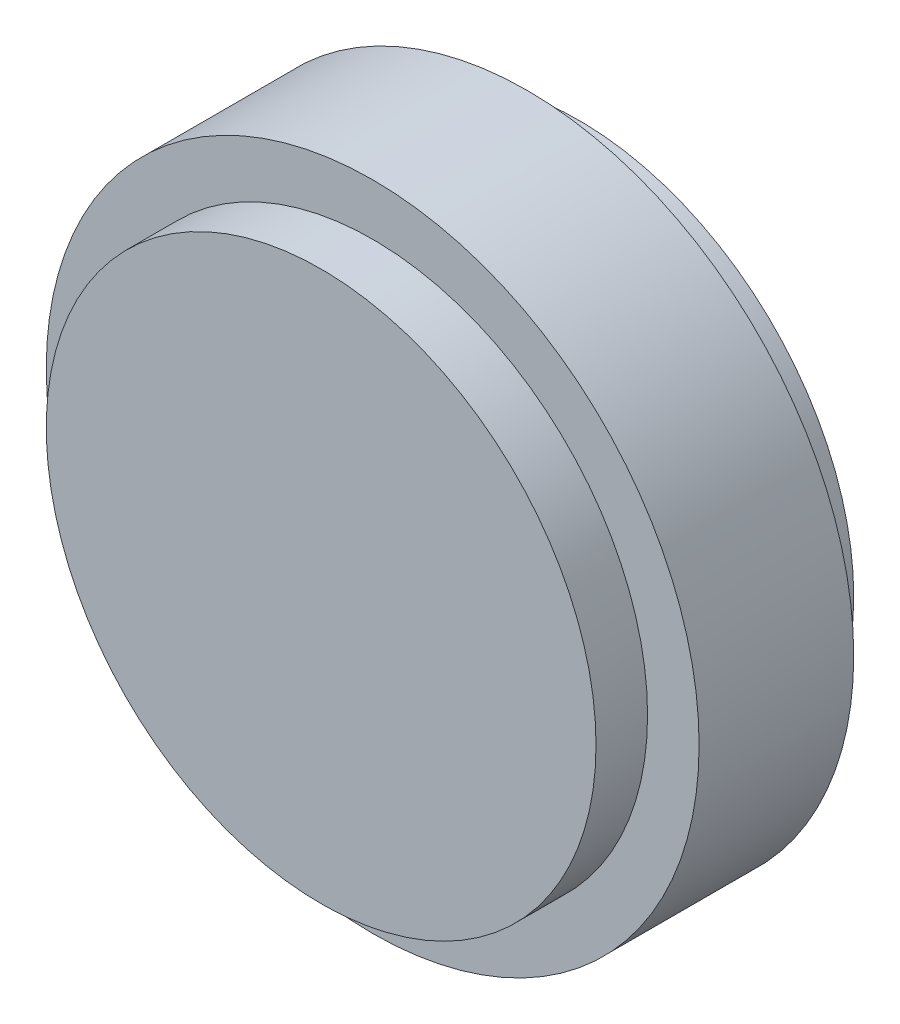
ISO-10303-21;
HEADER;
FILE_DESCRIPTION(('STEP AP214'),'2;1');
FILE_NAME('part.step','',(''),(''),'','','');
FILE_SCHEMA(('AUTOMOTIVE_DESIGN { 1 0 10303 214 1 1 1 1 }'));
ENDSEC;
DATA;
#1=APPLICATION_CONTEXT('core data for automotive mechanical design processes');
#2=APPLICATION_PROTOCOL_DEFINITION('international standard','automotive_design',2000,#1);
#3=PRODUCT_CONTEXT('',#1,'mechanical');
#4=PRODUCT('Part','Part','',(#3));
#5=PRODUCT_RELATED_PRODUCT_CATEGORY('part','',(#4));
#6=PRODUCT_DEFINITION_FORMATION('','',#4);
#7=PRODUCT_DEFINITION_CONTEXT('part definition',#1,'design');
#8=PRODUCT_DEFINITION('design','',#6,#7);
#9=PRODUCT_DEFINITION_SHAPE('','',#8);
#10=(LENGTH_UNIT() NAMED_UNIT(*) SI_UNIT(.MILLI.,.METRE.));
#11=(NAMED_UNIT(*) PLANE_ANGLE_UNIT() SI_UNIT($,.RADIAN.));
#12=(NAMED_UNIT(*) SI_UNIT($,.STERADIAN.) SOLID_ANGLE_UNIT());
#13=UNCERTAINTY_MEASURE_WITH_UNIT(LENGTH_MEASURE(1.E-05),#10,'distance_accuracy_value','');
#14=(GEOMETRIC_REPRESENTATION_CONTEXT(3) GLOBAL_UNCERTAINTY_ASSIGNED_CONTEXT((#13)) GLOBAL_UNIT_ASSIGNED_CONTEXT((#10,
#11,#12)) REPRESENTATION_CONTEXT('',''));
#15=CARTESIAN_POINT('',(0.,0.,0.));
#16=DIRECTION('',(0.,0.,1.));
#17=DIRECTION('',(1.,0.,0.));
#18=AXIS2_PLACEMENT_3D('',#15,#16,#17);
#19=CARTESIAN_POINT('',(0.,0.,0.));
#20=DIRECTION('',(0.,0.,-1.));
#21=DIRECTION('',(-1.,0.,0.));
#22=AXIS2_PLACEMENT_3D('',#19,#20,#21);
#23=PLANE('',#22);
#24=CARTESIAN_POINT('',(0.,0.,0.));
#25=DIRECTION('',(0.,0.,1.));
#26=DIRECTION('',(1.,0.,0.));
#27=AXIS2_PLACEMENT_3D('',#24,#25,#26);
#28=CIRCLE('',#27,16.);
#29=CARTESIAN_POINT('',(16.,0.,0.));
#30=VERTEX_POINT('',#29);
#31=EDGE_CURVE('E10',#30,#30,#28,.T.);
#32=ORIENTED_EDGE('',*,*,#31,.T.);
#33=EDGE_LOOP('',(#32));
#34=FACE_BOUND('',#33,.T.);
#35=ADVANCED_FACE('F37',(#34),#23,.F.);
#36=CARTESIAN_POINT('',(0.,0.,0.));
#37=DIRECTION('',(0.,0.,1.));
#38=DIRECTION('',(1.,0.,0.));
#39=AXIS2_PLACEMENT_3D('',#36,#37,#38);
#40=CYLINDRICAL_SURFACE('',#39,16.);
#41=ORIENTED_EDGE('',*,*,#31,.F.);
#42=EDGE_LOOP('',(#41));
#43=FACE_BOUND('',#42,.T.);
#44=CARTESIAN_POINT('',(0.,0.,-3.));
#45=DIRECTION('',(0.,0.,1.));
#46=DIRECTION('',(1.,0.,0.));
#47=AXIS2_PLACEMENT_3D('',#44,#45,#46);
#48=CIRCLE('',#47,16.);
#49=CARTESIAN_POINT('',(16.,0.,-3.));
#50=VERTEX_POINT('',#49);
#51=EDGE_CURVE('E43',#50,#50,#48,.T.);
#52=ORIENTED_EDGE('',*,*,#51,.T.);
#53=EDGE_LOOP('',(#52));
#54=FACE_BOUND('',#53,.T.);
#55=ADVANCED_FACE('F75',(#43,#54),#40,.T.);
#56=CARTESIAN_POINT('',(0.,16.,-3.));
#57=DIRECTION('',(0.,0.,-1.));
#58=DIRECTION('',(-1.,0.,0.));
#59=AXIS2_PLACEMENT_3D('',#56,#57,#58);
#60=PLANE('',#59);
#61=ORIENTED_EDGE('',*,*,#51,.F.);
#62=EDGE_LOOP('',(#61));
#63=FACE_BOUND('',#62,.T.);
#64=CARTESIAN_POINT('',(0.,0.,-3.));
#65=DIRECTION('',(0.,0.,1.));
#66=DIRECTION('',(1.,0.,0.));
#67=AXIS2_PLACEMENT_3D('',#64,#65,#66);
#68=CIRCLE('',#67,19.);
#69=CARTESIAN_POINT('',(19.,0.,-3.));
#70=VERTEX_POINT('',#69);
#71=EDGE_CURVE('E47',#70,#70,#68,.T.);
#72=ORIENTED_EDGE('',*,*,#71,.T.);
#73=EDGE_LOOP('',(#72));
#74=FACE_BOUND('',#73,.T.);
#75=ADVANCED_FACE('F79',(#63,#74),#60,.F.);
#76=CARTESIAN_POINT('',(0.,0.,0.));
#77=DIRECTION('',(0.,0.,1.));
#78=DIRECTION('',(1.,0.,0.));
#79=AXIS2_PLACEMENT_3D('',#76,#77,#78);
#80=CYLINDRICAL_SURFACE('',#79,19.);
#81=ORIENTED_EDGE('',*,*,#71,.F.);
#82=EDGE_LOOP('',(#81));
#83=FACE_BOUND('',#82,.T.);
#84=CARTESIAN_POINT('',(0.,0.,-12.));
#85=DIRECTION('',(0.,0.,1.));
#86=DIRECTION('',(1.,0.,0.));
#87=AXIS2_PLACEMENT_3D('',#84,#85,#86);
#88=CIRCLE('',#87,19.);
#89=CARTESIAN_POINT('',(19.,0.,-12.));
#90=VERTEX_POINT('',#89);
#91=EDGE_CURVE('E51',#90,#90,#88,.T.);
#92=ORIENTED_EDGE('',*,*,#91,.T.);
#93=EDGE_LOOP('',(#92));
#94=FACE_BOUND('',#93,.T.);
#95=ADVANCED_FACE('F84',(#83,#94),#80,.T.);
#96=CARTESIAN_POINT('',(0.,16.,-12.));
#97=DIRECTION('',(0.,0.,1.));
#98=DIRECTION('',(1.,0.,0.));
#99=AXIS2_PLACEMENT_3D('',#96,#97,#98);
#100=PLANE('',#99);
#101=ORIENTED_EDGE('',*,*,#91,.F.);
#102=EDGE_LOOP('',(#101));
#103=FACE_BOUND('',#102,.T.);
#104=CARTESIAN_POINT('',(0.,0.,-12.));
#105=DIRECTION('',(0.,0.,1.));
#106=DIRECTION('',(1.,0.,0.));
#107=AXIS2_PLACEMENT_3D('',#104,#105,#106);
#108=CIRCLE('',#107,16.);
#109=CARTESIAN_POINT('',(16.,0.,-12.));
#110=VERTEX_POINT('',#109);
#111=EDGE_CURVE('E56',#110,#110,#108,.T.);
#112=ORIENTED_EDGE('',*,*,#111,.T.);
#113=EDGE_LOOP('',(#112));
#114=FACE_BOUND('',#113,.T.);
#115=ADVANCED_FACE('F71',(#103,#114),#100,.F.);
#116=CARTESIAN_POINT('',(0.,0.,0.));
#117=DIRECTION('',(0.,0.,1.));
#118=DIRECTION('',(1.,0.,0.));
#119=AXIS2_PLACEMENT_3D('',#116,#117,#118);
#120=CYLINDRICAL_SURFACE('',#119,16.);
#121=ORIENTED_EDGE('',*,*,#111,.F.);
#122=EDGE_LOOP('',(#121));
#123=FACE_BOUND('',#122,.T.);
#124=CARTESIAN_POINT('',(0.,0.,-15.));
#125=DIRECTION('',(0.,0.,1.));
#126=DIRECTION('',(1.,0.,0.));
#127=AXIS2_PLACEMENT_3D('',#124,#125,#126);
#128=CIRCLE('',#127,16.);
#129=CARTESIAN_POINT('',(16.,0.,-15.));
#130=VERTEX_POINT('',#129);
#131=EDGE_CURVE('E59',#130,#130,#128,.T.);
#132=ORIENTED_EDGE('',*,*,#131,.T.);
#133=EDGE_LOOP('',(#132));
#134=FACE_BOUND('',#133,.T.);
#135=ADVANCED_FACE('F63',(#123,#134),#120,.T.);
#136=CARTESIAN_POINT('',(0.,0.,-15.));
#137=DIRECTION('',(0.,0.,1.));
#138=DIRECTION('',(1.,0.,0.));
#139=AXIS2_PLACEMENT_3D('',#136,#137,#138);
#140=PLANE('',#139);
#141=ORIENTED_EDGE('',*,*,#131,.F.);
#142=EDGE_LOOP('',(#141));
#143=FACE_BOUND('',#142,.T.);
#144=ADVANCED_FACE('F65',(#143),#140,.F.);
#145=CLOSED_SHELL('',(#35,#55,#75,#95,#115,#135,#144));
#146=MANIFOLD_SOLID_BREP('B2',#145);
#147=ADVANCED_BREP_SHAPE_REPRESENTATION('',(#18,#146),#14);
#148=SHAPE_DEFINITION_REPRESENTATION(#9,#147);
ENDSEC;
END-ISO-10303-21;
